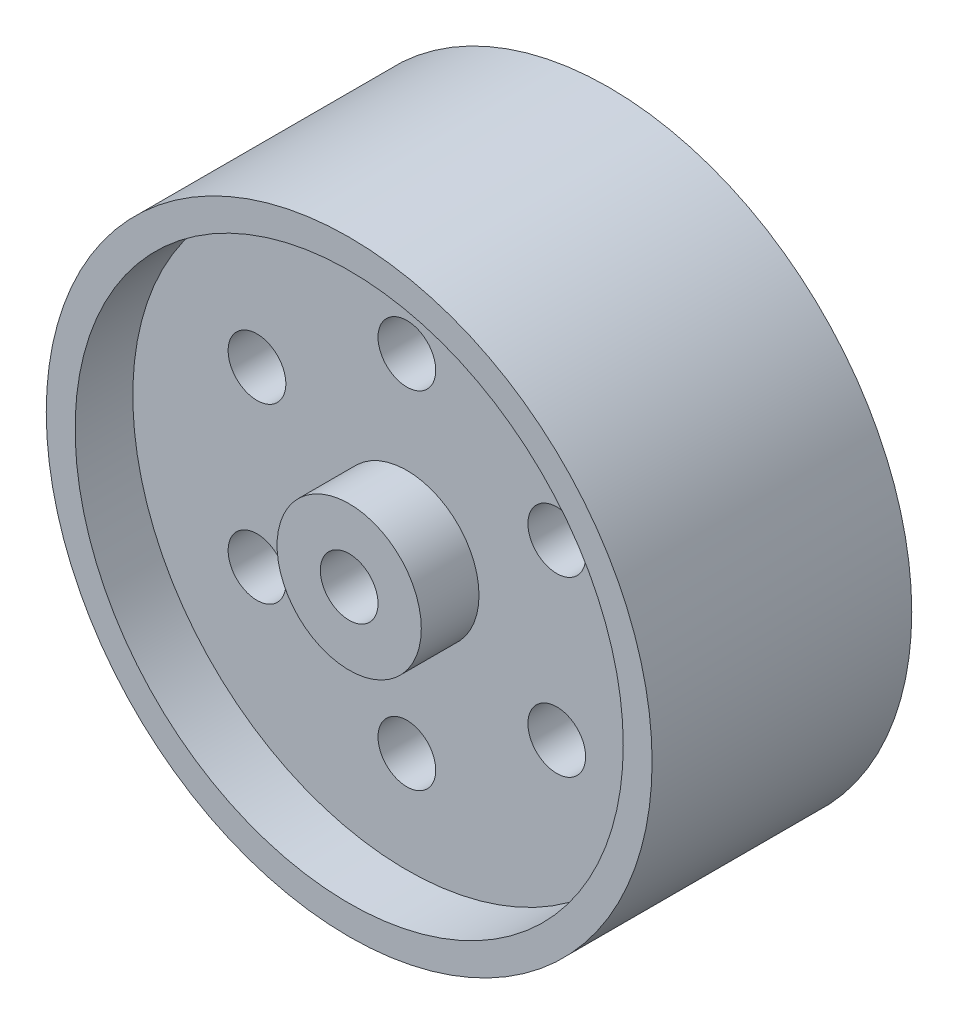
ISO-10303-21;
HEADER;
FILE_DESCRIPTION(('STEP AP214'),'2;1');
FILE_NAME('part.step','',(''),(''),'','','');
FILE_SCHEMA(('AUTOMOTIVE_DESIGN { 1 0 10303 214 1 1 1 1 }'));
ENDSEC;
DATA;
#1=APPLICATION_CONTEXT('core data for automotive mechanical design processes');
#2=APPLICATION_PROTOCOL_DEFINITION('international standard','automotive_design',2000,#1);
#3=PRODUCT_CONTEXT('',#1,'mechanical');
#4=PRODUCT('Part','Part','',(#3));
#5=PRODUCT_RELATED_PRODUCT_CATEGORY('part','',(#4));
#6=PRODUCT_DEFINITION_FORMATION('','',#4);
#7=PRODUCT_DEFINITION_CONTEXT('part definition',#1,'design');
#8=PRODUCT_DEFINITION('design','',#6,#7);
#9=PRODUCT_DEFINITION_SHAPE('','',#8);
#10=(LENGTH_UNIT() NAMED_UNIT(*) SI_UNIT(.MILLI.,.METRE.));
#11=(NAMED_UNIT(*) PLANE_ANGLE_UNIT() SI_UNIT($,.RADIAN.));
#12=(NAMED_UNIT(*) SI_UNIT($,.STERADIAN.) SOLID_ANGLE_UNIT());
#13=UNCERTAINTY_MEASURE_WITH_UNIT(LENGTH_MEASURE(1.E-05),#10,'distance_accuracy_value','');
#14=(GEOMETRIC_REPRESENTATION_CONTEXT(3) GLOBAL_UNCERTAINTY_ASSIGNED_CONTEXT((#13)) GLOBAL_UNIT_ASSIGNED_CONTEXT((#10,
#11,#12)) REPRESENTATION_CONTEXT('',''));
#15=CARTESIAN_POINT('',(0.,0.,0.));
#16=DIRECTION('',(0.,0.,1.));
#17=DIRECTION('',(1.,0.,0.));
#18=AXIS2_PLACEMENT_3D('',#15,#16,#17);
#19=CARTESIAN_POINT('',(0.,0.,6.26370656370656));
#20=DIRECTION('',(0.,0.,1.));
#21=DIRECTION('',(1.,0.,0.));
#22=AXIS2_PLACEMENT_3D('',#19,#20,#21);
#23=CYLINDRICAL_SURFACE('',#22,2.);
#24=CARTESIAN_POINT('',(0.,0.,-7.));
#25=DIRECTION('',(0.,0.,1.));
#26=DIRECTION('',(1.,0.,0.));
#27=AXIS2_PLACEMENT_3D('',#24,#25,#26);
#28=CIRCLE('',#27,2.);
#29=CARTESIAN_POINT('',(2.,0.,-7.));
#30=VERTEX_POINT('',#29);
#31=EDGE_CURVE('E65',#30,#30,#28,.T.);
#32=ORIENTED_EDGE('',*,*,#31,.F.);
#33=EDGE_LOOP('',(#32));
#34=FACE_BOUND('',#33,.T.);
#35=CARTESIAN_POINT('',(0.,0.,7.));
#36=DIRECTION('',(0.,0.,1.));
#37=DIRECTION('',(1.,0.,0.));
#38=AXIS2_PLACEMENT_3D('',#35,#36,#37);
#39=CIRCLE('',#38,2.);
#40=CARTESIAN_POINT('',(2.,0.,7.));
#41=VERTEX_POINT('',#40);
#42=EDGE_CURVE('E10',#41,#41,#39,.T.);
#43=ORIENTED_EDGE('',*,*,#42,.T.);
#44=EDGE_LOOP('',(#43));
#45=FACE_BOUND('',#44,.T.);
#46=ADVANCED_FACE('F31',(#34,#45),#23,.F.);
#47=CARTESIAN_POINT('',(0.,2.,7.));
#48=DIRECTION('',(0.,0.,-1.));
#49=DIRECTION('',(-1.,0.,0.));
#50=AXIS2_PLACEMENT_3D('',#47,#48,#49);
#51=PLANE('',#50);
#52=ORIENTED_EDGE('',*,*,#42,.F.);
#53=EDGE_LOOP('',(#52));
#54=FACE_BOUND('',#53,.T.);
#55=CARTESIAN_POINT('',(0.,0.,7.));
#56=DIRECTION('',(0.,0.,1.));
#57=DIRECTION('',(1.,0.,0.));
#58=AXIS2_PLACEMENT_3D('',#55,#56,#57);
#59=CIRCLE('',#58,5.);
#60=CARTESIAN_POINT('',(5.,0.,7.));
#61=VERTEX_POINT('',#60);
#62=EDGE_CURVE('E37',#61,#61,#59,.T.);
#63=ORIENTED_EDGE('',*,*,#62,.T.);
#64=EDGE_LOOP('',(#63));
#65=FACE_BOUND('',#64,.T.);
#66=ADVANCED_FACE('F129',(#54,#65),#51,.F.);
#67=CARTESIAN_POINT('',(0.,0.,6.26370656370656));
#68=DIRECTION('',(0.,0.,1.));
#69=DIRECTION('',(1.,0.,0.));
#70=AXIS2_PLACEMENT_3D('',#67,#68,#69);
#71=CYLINDRICAL_SURFACE('',#70,5.);
#72=ORIENTED_EDGE('',*,*,#62,.F.);
#73=EDGE_LOOP('',(#72));
#74=FACE_BOUND('',#73,.T.);
#75=CARTESIAN_POINT('',(0.,0.,3.));
#76=DIRECTION('',(0.,0.,1.));
#77=DIRECTION('',(1.,0.,0.));
#78=AXIS2_PLACEMENT_3D('',#75,#76,#77);
#79=CIRCLE('',#78,5.);
#80=CARTESIAN_POINT('',(5.,0.,3.));
#81=VERTEX_POINT('',#80);
#82=EDGE_CURVE('E41',#81,#81,#79,.T.);
#83=ORIENTED_EDGE('',*,*,#82,.T.);
#84=EDGE_LOOP('',(#83));
#85=FACE_BOUND('',#84,.T.);
#86=ADVANCED_FACE('F133',(#74,#85),#71,.T.);
#87=CARTESIAN_POINT('',(0.,5.,3.));
#88=DIRECTION('',(0.,0.,-1.));
#89=DIRECTION('',(-1.,0.,0.));
#90=AXIS2_PLACEMENT_3D('',#87,#88,#89);
#91=PLANE('',#90);
#92=CARTESIAN_POINT('',(0.,12.,3.));
#93=DIRECTION('',(0.,0.,-1.));
#94=DIRECTION('',(-1.,0.,0.));
#95=AXIS2_PLACEMENT_3D('',#92,#93,#94);
#96=CIRCLE('',#95,2.);
#97=CARTESIAN_POINT('',(-2.,12.,3.));
#98=VERTEX_POINT('',#97);
#99=EDGE_CURVE('E68',#98,#98,#96,.T.);
#100=ORIENTED_EDGE('',*,*,#99,.T.);
#101=EDGE_LOOP('',(#100));
#102=FACE_BOUND('',#101,.T.);
#103=CARTESIAN_POINT('',(10.3923048454129,5.9999999999994,3.));
#104=DIRECTION('',(0.,0.,-1.));
#105=DIRECTION('',(-1.,0.,0.));
#106=AXIS2_PLACEMENT_3D('',#103,#104,#105);
#107=CIRCLE('',#106,2.00000000000064);
#108=CARTESIAN_POINT('',(8.39230484541229,5.9999999999994,3.));
#109=VERTEX_POINT('',#108);
#110=EDGE_CURVE('E71',#109,#109,#107,.T.);
#111=ORIENTED_EDGE('',*,*,#110,.T.);
#112=EDGE_LOOP('',(#111));
#113=FACE_BOUND('',#112,.T.);
#114=CARTESIAN_POINT('',(10.3923048454122,-6.00000000000059,3.));
#115=DIRECTION('',(0.,0.,-1.));
#116=DIRECTION('',(-1.,0.,0.));
#117=AXIS2_PLACEMENT_3D('',#114,#115,#116);
#118=CIRCLE('',#117,2.00000000000126);
#119=CARTESIAN_POINT('',(8.39230484541099,-6.00000000000059,3.));
#120=VERTEX_POINT('',#119);
#121=EDGE_CURVE('E74',#120,#120,#118,.T.);
#122=ORIENTED_EDGE('',*,*,#121,.T.);
#123=EDGE_LOOP('',(#122));
#124=FACE_BOUND('',#123,.T.);
#125=CARTESIAN_POINT('',(-1.35983332418246E-12,-12.,3.));
#126=DIRECTION('',(0.,0.,-1.));
#127=DIRECTION('',(-1.,0.,0.));
#128=AXIS2_PLACEMENT_3D('',#125,#126,#127);
#129=CIRCLE('',#128,2.00000000000138);
#130=CARTESIAN_POINT('',(-2.00000000000274,-12.,3.));
#131=VERTEX_POINT('',#130);
#132=EDGE_CURVE('E77',#131,#131,#129,.T.);
#133=ORIENTED_EDGE('',*,*,#132,.T.);
#134=EDGE_LOOP('',(#133));
#135=FACE_BOUND('',#134,.T.);
#136=CARTESIAN_POINT('',(-10.3923048454143,-5.99999999999941,3.));
#137=DIRECTION('',(0.,0.,-1.));
#138=DIRECTION('',(-1.,0.,0.));
#139=AXIS2_PLACEMENT_3D('',#136,#137,#138);
#140=CIRCLE('',#139,2.00000000000086);
#141=CARTESIAN_POINT('',(-12.3923048454151,-5.99999999999941,3.));
#142=VERTEX_POINT('',#141);
#143=EDGE_CURVE('E80',#142,#142,#140,.T.);
#144=ORIENTED_EDGE('',*,*,#143,.T.);
#145=EDGE_LOOP('',(#144));
#146=FACE_BOUND('',#145,.T.);
#147=CARTESIAN_POINT('',(-10.3923048454136,6.00000000000059,3.));
#148=DIRECTION('',(0.,0.,-1.));
#149=DIRECTION('',(-1.,0.,0.));
#150=AXIS2_PLACEMENT_3D('',#147,#148,#149);
#151=CIRCLE('',#150,2.00000000000019);
#152=CARTESIAN_POINT('',(-12.3923048454138,6.00000000000059,3.));
#153=VERTEX_POINT('',#152);
#154=EDGE_CURVE('E83',#153,#153,#151,.T.);
#155=ORIENTED_EDGE('',*,*,#154,.T.);
#156=EDGE_LOOP('',(#155));
#157=FACE_BOUND('',#156,.T.);
#158=ORIENTED_EDGE('',*,*,#82,.F.);
#159=EDGE_LOOP('',(#158));
#160=FACE_BOUND('',#159,.T.);
#161=CARTESIAN_POINT('',(0.,0.,3.));
#162=DIRECTION('',(0.,0.,1.));
#163=DIRECTION('',(1.,0.,0.));
#164=AXIS2_PLACEMENT_3D('',#161,#162,#163);
#165=CIRCLE('',#164,19.);
#166=CARTESIAN_POINT('',(19.,0.,3.));
#167=VERTEX_POINT('',#166);
#168=EDGE_CURVE('E45',#167,#167,#165,.T.);
#169=ORIENTED_EDGE('',*,*,#168,.T.);
#170=EDGE_LOOP('',(#169));
#171=FACE_BOUND('',#170,.T.);
#172=ADVANCED_FACE('F138',(#102,#113,#124,#135,#146,#157,#160,#171),#91,.F.);
#173=CARTESIAN_POINT('',(0.,0.,6.26370656370656));
#174=DIRECTION('',(0.,0.,1.));
#175=DIRECTION('',(1.,0.,0.));
#176=AXIS2_PLACEMENT_3D('',#173,#174,#175);
#177=CYLINDRICAL_SURFACE('',#176,19.);
#178=ORIENTED_EDGE('',*,*,#168,.F.);
#179=EDGE_LOOP('',(#178));
#180=FACE_BOUND('',#179,.T.);
#181=CARTESIAN_POINT('',(0.,0.,7.));
#182=DIRECTION('',(0.,0.,1.));
#183=DIRECTION('',(1.,0.,0.));
#184=AXIS2_PLACEMENT_3D('',#181,#182,#183);
#185=CIRCLE('',#184,19.);
#186=CARTESIAN_POINT('',(19.,0.,7.));
#187=VERTEX_POINT('',#186);
#188=EDGE_CURVE('E50',#187,#187,#185,.T.);
#189=ORIENTED_EDGE('',*,*,#188,.T.);
#190=EDGE_LOOP('',(#189));
#191=FACE_BOUND('',#190,.T.);
#192=ADVANCED_FACE('F144',(#180,#191),#177,.F.);
#193=CARTESIAN_POINT('',(0.,19.,7.));
#194=DIRECTION('',(0.,0.,-1.));
#195=DIRECTION('',(-1.,0.,0.));
#196=AXIS2_PLACEMENT_3D('',#193,#194,#195);
#197=PLANE('',#196);
#198=ORIENTED_EDGE('',*,*,#188,.F.);
#199=EDGE_LOOP('',(#198));
#200=FACE_BOUND('',#199,.T.);
#201=CARTESIAN_POINT('',(0.,0.,7.));
#202=DIRECTION('',(0.,0.,1.));
#203=DIRECTION('',(1.,0.,0.));
#204=AXIS2_PLACEMENT_3D('',#201,#202,#203);
#205=CIRCLE('',#204,21.);
#206=CARTESIAN_POINT('',(21.,0.,7.));
#207=VERTEX_POINT('',#206);
#208=EDGE_CURVE('E53',#207,#207,#205,.T.);
#209=ORIENTED_EDGE('',*,*,#208,.T.);
#210=EDGE_LOOP('',(#209));
#211=FACE_BOUND('',#210,.T.);
#212=ADVANCED_FACE('F148',(#200,#211),#197,.F.);
#213=CARTESIAN_POINT('',(0.,0.,6.26370656370656));
#214=DIRECTION('',(0.,0.,1.));
#215=DIRECTION('',(1.,0.,0.));
#216=AXIS2_PLACEMENT_3D('',#213,#214,#215);
#217=CYLINDRICAL_SURFACE('',#216,21.);
#218=ORIENTED_EDGE('',*,*,#208,.F.);
#219=EDGE_LOOP('',(#218));
#220=FACE_BOUND('',#219,.T.);
#221=CARTESIAN_POINT('',(0.,0.,-11.));
#222=DIRECTION('',(0.,0.,1.));
#223=DIRECTION('',(1.,0.,0.));
#224=AXIS2_PLACEMENT_3D('',#221,#222,#223);
#225=CIRCLE('',#224,21.);
#226=CARTESIAN_POINT('',(21.,0.,-11.));
#227=VERTEX_POINT('',#226);
#228=EDGE_CURVE('E56',#227,#227,#225,.T.);
#229=ORIENTED_EDGE('',*,*,#228,.T.);
#230=EDGE_LOOP('',(#229));
#231=FACE_BOUND('',#230,.T.);
#232=ADVANCED_FACE('F152',(#220,#231),#217,.T.);
#233=CARTESIAN_POINT('',(0.,21.,-11.));
#234=DIRECTION('',(0.,0.,1.));
#235=DIRECTION('',(1.,0.,0.));
#236=AXIS2_PLACEMENT_3D('',#233,#234,#235);
#237=PLANE('',#236);
#238=ORIENTED_EDGE('',*,*,#228,.F.);
#239=EDGE_LOOP('',(#238));
#240=FACE_BOUND('',#239,.T.);
#241=CARTESIAN_POINT('',(0.,0.,-11.));
#242=DIRECTION('',(0.,0.,1.));
#243=DIRECTION('',(1.,0.,0.));
#244=AXIS2_PLACEMENT_3D('',#241,#242,#243);
#245=CIRCLE('',#244,15.);
#246=CARTESIAN_POINT('',(15.,0.,-11.));
#247=VERTEX_POINT('',#246);
#248=EDGE_CURVE('E59',#247,#247,#245,.T.);
#249=ORIENTED_EDGE('',*,*,#248,.T.);
#250=EDGE_LOOP('',(#249));
#251=FACE_BOUND('',#250,.T.);
#252=ADVANCED_FACE('F156',(#240,#251),#237,.F.);
#253=CARTESIAN_POINT('',(0.,0.,6.26370656370656));
#254=DIRECTION('',(0.,0.,1.));
#255=DIRECTION('',(1.,0.,0.));
#256=AXIS2_PLACEMENT_3D('',#253,#254,#255);
#257=CYLINDRICAL_SURFACE('',#256,15.);
#258=ORIENTED_EDGE('',*,*,#248,.F.);
#259=EDGE_LOOP('',(#258));
#260=FACE_BOUND('',#259,.T.);
#261=CARTESIAN_POINT('',(0.,0.,-7.));
#262=DIRECTION('',(0.,0.,1.));
#263=DIRECTION('',(1.,0.,0.));
#264=AXIS2_PLACEMENT_3D('',#261,#262,#263);
#265=CIRCLE('',#264,15.);
#266=CARTESIAN_POINT('',(15.,0.,-7.));
#267=VERTEX_POINT('',#266);
#268=EDGE_CURVE('E62',#267,#267,#265,.T.);
#269=ORIENTED_EDGE('',*,*,#268,.T.);
#270=EDGE_LOOP('',(#269));
#271=FACE_BOUND('',#270,.T.);
#272=ADVANCED_FACE('F112',(#260,#271),#257,.F.);
#273=CARTESIAN_POINT('',(0.,15.,-7.));
#274=DIRECTION('',(0.,0.,1.));
#275=DIRECTION('',(1.,0.,0.));
#276=AXIS2_PLACEMENT_3D('',#273,#274,#275);
#277=PLANE('',#276);
#278=CARTESIAN_POINT('',(0.,12.,-7.));
#279=DIRECTION('',(0.,0.,-1.));
#280=DIRECTION('',(-1.,0.,0.));
#281=AXIS2_PLACEMENT_3D('',#278,#279,#280);
#282=CIRCLE('',#281,2.);
#283=CARTESIAN_POINT('',(-2.,12.,-7.));
#284=VERTEX_POINT('',#283);
#285=EDGE_CURVE('E86',#284,#284,#282,.T.);
#286=ORIENTED_EDGE('',*,*,#285,.F.);
#287=EDGE_LOOP('',(#286));
#288=FACE_BOUND('',#287,.T.);
#289=CARTESIAN_POINT('',(10.3923048454129,5.9999999999994,-7.));
#290=DIRECTION('',(0.,0.,-1.));
#291=DIRECTION('',(-1.,0.,0.));
#292=AXIS2_PLACEMENT_3D('',#289,#290,#291);
#293=CIRCLE('',#292,2.00000000000064);
#294=CARTESIAN_POINT('',(8.39230484541229,5.9999999999994,-7.));
#295=VERTEX_POINT('',#294);
#296=EDGE_CURVE('E91',#295,#295,#293,.T.);
#297=ORIENTED_EDGE('',*,*,#296,.F.);
#298=EDGE_LOOP('',(#297));
#299=FACE_BOUND('',#298,.T.);
#300=CARTESIAN_POINT('',(10.3923048454122,-6.00000000000059,-7.));
#301=DIRECTION('',(0.,0.,-1.));
#302=DIRECTION('',(-1.,0.,0.));
#303=AXIS2_PLACEMENT_3D('',#300,#301,#302);
#304=CIRCLE('',#303,2.00000000000126);
#305=CARTESIAN_POINT('',(8.39230484541099,-6.00000000000059,-7.));
#306=VERTEX_POINT('',#305);
#307=EDGE_CURVE('E87',#306,#306,#304,.T.);
#308=ORIENTED_EDGE('',*,*,#307,.F.);
#309=EDGE_LOOP('',(#308));
#310=FACE_BOUND('',#309,.T.);
#311=CARTESIAN_POINT('',(-1.35983332418246E-12,-12.,-7.));
#312=DIRECTION('',(0.,0.,-1.));
#313=DIRECTION('',(-1.,0.,0.));
#314=AXIS2_PLACEMENT_3D('',#311,#312,#313);
#315=CIRCLE('',#314,2.00000000000138);
#316=CARTESIAN_POINT('',(-2.00000000000274,-12.,-7.));
#317=VERTEX_POINT('',#316);
#318=EDGE_CURVE('E90',#317,#317,#315,.T.);
#319=ORIENTED_EDGE('',*,*,#318,.F.);
#320=EDGE_LOOP('',(#319));
#321=FACE_BOUND('',#320,.T.);
#322=CARTESIAN_POINT('',(-10.3923048454143,-5.99999999999941,-7.));
#323=DIRECTION('',(0.,0.,-1.));
#324=DIRECTION('',(-1.,0.,0.));
#325=AXIS2_PLACEMENT_3D('',#322,#323,#324);
#326=CIRCLE('',#325,2.00000000000086);
#327=CARTESIAN_POINT('',(-12.3923048454151,-5.99999999999941,-7.));
#328=VERTEX_POINT('',#327);
#329=EDGE_CURVE('E94',#328,#328,#326,.T.);
#330=ORIENTED_EDGE('',*,*,#329,.F.);
#331=EDGE_LOOP('',(#330));
#332=FACE_BOUND('',#331,.T.);
#333=CARTESIAN_POINT('',(-10.3923048454136,6.00000000000059,-7.));
#334=DIRECTION('',(0.,0.,-1.));
#335=DIRECTION('',(-1.,0.,0.));
#336=AXIS2_PLACEMENT_3D('',#333,#334,#335);
#337=CIRCLE('',#336,2.00000000000019);
#338=CARTESIAN_POINT('',(-12.3923048454138,6.00000000000059,-7.));
#339=VERTEX_POINT('',#338);
#340=EDGE_CURVE('E97',#339,#339,#337,.T.);
#341=ORIENTED_EDGE('',*,*,#340,.F.);
#342=EDGE_LOOP('',(#341));
#343=FACE_BOUND('',#342,.T.);
#344=ORIENTED_EDGE('',*,*,#268,.F.);
#345=EDGE_LOOP('',(#344));
#346=FACE_BOUND('',#345,.T.);
#347=ORIENTED_EDGE('',*,*,#31,.T.);
#348=EDGE_LOOP('',(#347));
#349=FACE_BOUND('',#348,.T.);
#350=ADVANCED_FACE('F108',(#288,#299,#310,#321,#332,#343,#346,#349),#277,.F.);
#351=CARTESIAN_POINT('',(-10.3923048454136,6.00000000000059,7.));
#352=DIRECTION('',(0.,0.,-1.));
#353=DIRECTION('',(-1.,0.,0.));
#354=AXIS2_PLACEMENT_3D('',#351,#352,#353);
#355=CYLINDRICAL_SURFACE('',#354,2.00000000000019);
#356=ORIENTED_EDGE('',*,*,#340,.T.);
#357=EDGE_LOOP('',(#356));
#358=FACE_BOUND('',#357,.T.);
#359=ORIENTED_EDGE('',*,*,#154,.F.);
#360=EDGE_LOOP('',(#359));
#361=FACE_BOUND('',#360,.T.);
#362=ADVANCED_FACE('F111',(#358,#361),#355,.F.);
#363=CARTESIAN_POINT('',(-10.3923048454143,-5.99999999999941,7.));
#364=DIRECTION('',(0.,0.,-1.));
#365=DIRECTION('',(-1.,0.,0.));
#366=AXIS2_PLACEMENT_3D('',#363,#364,#365);
#367=CYLINDRICAL_SURFACE('',#366,2.00000000000086);
#368=ORIENTED_EDGE('',*,*,#329,.T.);
#369=EDGE_LOOP('',(#368));
#370=FACE_BOUND('',#369,.T.);
#371=ORIENTED_EDGE('',*,*,#143,.F.);
#372=EDGE_LOOP('',(#371));
#373=FACE_BOUND('',#372,.T.);
#374=ADVANCED_FACE('F172',(#370,#373),#367,.F.);
#375=CARTESIAN_POINT('',(-1.35983332418246E-12,-12.,7.));
#376=DIRECTION('',(0.,0.,-1.));
#377=DIRECTION('',(-1.,0.,0.));
#378=AXIS2_PLACEMENT_3D('',#375,#376,#377);
#379=CYLINDRICAL_SURFACE('',#378,2.00000000000138);
#380=ORIENTED_EDGE('',*,*,#318,.T.);
#381=EDGE_LOOP('',(#380));
#382=FACE_BOUND('',#381,.T.);
#383=ORIENTED_EDGE('',*,*,#132,.F.);
#384=EDGE_LOOP('',(#383));
#385=FACE_BOUND('',#384,.T.);
#386=ADVANCED_FACE('F168',(#382,#385),#379,.F.);
#387=CARTESIAN_POINT('',(10.3923048454122,-6.00000000000059,7.));
#388=DIRECTION('',(0.,0.,-1.));
#389=DIRECTION('',(-1.,0.,0.));
#390=AXIS2_PLACEMENT_3D('',#387,#388,#389);
#391=CYLINDRICAL_SURFACE('',#390,2.00000000000126);
#392=ORIENTED_EDGE('',*,*,#307,.T.);
#393=EDGE_LOOP('',(#392));
#394=FACE_BOUND('',#393,.T.);
#395=ORIENTED_EDGE('',*,*,#121,.F.);
#396=EDGE_LOOP('',(#395));
#397=FACE_BOUND('',#396,.T.);
#398=ADVANCED_FACE('F164',(#394,#397),#391,.F.);
#399=CARTESIAN_POINT('',(10.3923048454129,5.9999999999994,7.));
#400=DIRECTION('',(0.,0.,-1.));
#401=DIRECTION('',(-1.,0.,0.));
#402=AXIS2_PLACEMENT_3D('',#399,#400,#401);
#403=CYLINDRICAL_SURFACE('',#402,2.00000000000064);
#404=ORIENTED_EDGE('',*,*,#296,.T.);
#405=EDGE_LOOP('',(#404));
#406=FACE_BOUND('',#405,.T.);
#407=ORIENTED_EDGE('',*,*,#110,.F.);
#408=EDGE_LOOP('',(#407));
#409=FACE_BOUND('',#408,.T.);
#410=ADVANCED_FACE('F167',(#406,#409),#403,.F.);
#411=CARTESIAN_POINT('',(0.,12.,7.));
#412=DIRECTION('',(0.,0.,-1.));
#413=DIRECTION('',(-1.,0.,0.));
#414=AXIS2_PLACEMENT_3D('',#411,#412,#413);
#415=CYLINDRICAL_SURFACE('',#414,2.);
#416=ORIENTED_EDGE('',*,*,#285,.T.);
#417=EDGE_LOOP('',(#416));
#418=FACE_BOUND('',#417,.T.);
#419=ORIENTED_EDGE('',*,*,#99,.F.);
#420=EDGE_LOOP('',(#419));
#421=FACE_BOUND('',#420,.T.);
#422=ADVANCED_FACE('F105',(#418,#421),#415,.F.);
#423=CLOSED_SHELL('',(#46,#66,#86,#172,#192,#212,#232,#252,#272,#350,#362,#374,#386,#398,#410,#422));
#424=MANIFOLD_SOLID_BREP('B2',#423);
#425=ADVANCED_BREP_SHAPE_REPRESENTATION('',(#18,#424),#14);
#426=SHAPE_DEFINITION_REPRESENTATION(#9,#425);
ENDSEC;
END-ISO-10303-21;
